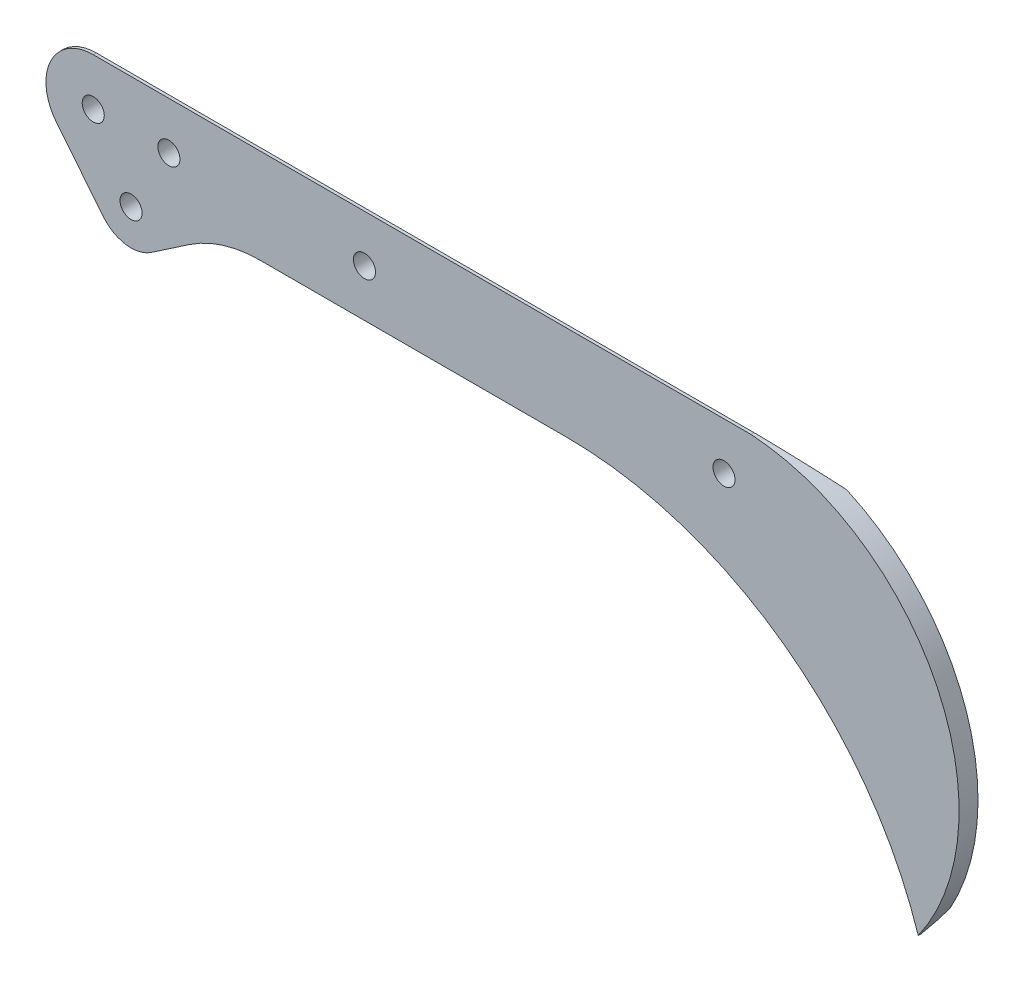
ISO-10303-21;
HEADER;
FILE_DESCRIPTION(('STEP AP214'),'2;1');
FILE_NAME('part.step','',(''),(''),'','','');
FILE_SCHEMA(('AUTOMOTIVE_DESIGN { 1 0 10303 214 1 1 1 1 }'));
ENDSEC;
DATA;
#1=APPLICATION_CONTEXT('core data for automotive mechanical design processes');
#2=APPLICATION_PROTOCOL_DEFINITION('international standard','automotive_design',2000,#1);
#3=PRODUCT_CONTEXT('',#1,'mechanical');
#4=PRODUCT('Part','Part','',(#3));
#5=PRODUCT_RELATED_PRODUCT_CATEGORY('part','',(#4));
#6=PRODUCT_DEFINITION_FORMATION('','',#4);
#7=PRODUCT_DEFINITION_CONTEXT('part definition',#1,'design');
#8=PRODUCT_DEFINITION('design','',#6,#7);
#9=PRODUCT_DEFINITION_SHAPE('','',#8);
#10=(LENGTH_UNIT() NAMED_UNIT(*) SI_UNIT(.MILLI.,.METRE.));
#11=(NAMED_UNIT(*) PLANE_ANGLE_UNIT() SI_UNIT($,.RADIAN.));
#12=(NAMED_UNIT(*) SI_UNIT($,.STERADIAN.) SOLID_ANGLE_UNIT());
#13=UNCERTAINTY_MEASURE_WITH_UNIT(LENGTH_MEASURE(1.E-05),#10,'distance_accuracy_value','');
#14=(GEOMETRIC_REPRESENTATION_CONTEXT(3) GLOBAL_UNCERTAINTY_ASSIGNED_CONTEXT((#13)) GLOBAL_UNIT_ASSIGNED_CONTEXT((#10,
#11,#12)) REPRESENTATION_CONTEXT('',''));
#15=CARTESIAN_POINT('',(0.,0.,0.));
#16=DIRECTION('',(0.,0.,1.));
#17=DIRECTION('',(1.,0.,0.));
#18=AXIS2_PLACEMENT_3D('',#15,#16,#17);
#19=CARTESIAN_POINT('',(-43.,0.,3.));
#20=DIRECTION('',(0.,0.,-1.));
#21=DIRECTION('',(-1.,0.,0.));
#22=AXIS2_PLACEMENT_3D('',#19,#20,#21);
#23=CYLINDRICAL_SURFACE('',#22,7.5);
#24=DIRECTION('',(0.,0.,-1.));
#25=VECTOR('',#24,1.);
#26=CARTESIAN_POINT('',(-43.,7.5,3.));
#27=LINE('',#26,#25);
#28=CARTESIAN_POINT('',(-43.,7.5,3.));
#29=VERTEX_POINT('',#28);
#30=CARTESIAN_POINT('',(-43.,7.5,2.51729889353185));
#31=VERTEX_POINT('',#30);
#32=EDGE_CURVE('E223',#29,#31,#27,.T.);
#33=ORIENTED_EDGE('',*,*,#32,.T.);
#34=CARTESIAN_POINT('',(-43.,0.,2.51729889353185));
#35=DIRECTION('',(0.,0.,1.));
#36=DIRECTION('',(1.,0.,0.));
#37=AXIS2_PLACEMENT_3D('',#34,#35,#36);
#38=CIRCLE('',#37,7.5);
#39=CARTESIAN_POINT('',(-48.8413704008258,-4.70408246530143,2.51729889353185));
#40=VERTEX_POINT('',#39);
#41=EDGE_CURVE('E386',#31,#40,#38,.T.);
#42=ORIENTED_EDGE('',*,*,#41,.T.);
#43=DIRECTION('',(0.,0.,-1.));
#44=VECTOR('',#43,1.);
#45=CARTESIAN_POINT('',(-48.8413704008258,-4.70408246530143,39.4567188799011));
#46=LINE('',#45,#44);
#47=CARTESIAN_POINT('',(-48.8413704008258,-4.70408246530143,3.));
#48=VERTEX_POINT('',#47);
#49=EDGE_CURVE('E166',#48,#40,#46,.T.);
#50=ORIENTED_EDGE('',*,*,#49,.F.);
#51=CARTESIAN_POINT('',(-43.,0.,3.));
#52=DIRECTION('',(0.,0.,1.));
#53=DIRECTION('',(1.,0.,0.));
#54=AXIS2_PLACEMENT_3D('',#51,#52,#53);
#55=CIRCLE('',#54,7.5);
#56=EDGE_CURVE('E172',#29,#48,#55,.T.);
#57=ORIENTED_EDGE('',*,*,#56,.F.);
#58=EDGE_LOOP('',(#33,#42,#50,#57));
#59=FACE_BOUND('',#58,.T.);
#60=ADVANCED_FACE('F43',(#59),#23,.T.);
#61=CARTESIAN_POINT('',(-43.,-7.5,3.));
#62=DIRECTION('',(0.,1.,0.));
#63=DIRECTION('',(-1.,0.,0.));
#64=AXIS2_PLACEMENT_3D('',#61,#62,#63);
#65=PLANE('',#64);
#66=DIRECTION('',(0.,0.,-1.));
#67=VECTOR('',#66,1.);
#68=CARTESIAN_POINT('',(-16.5222456176888,-7.5,0.));
#69=LINE('',#68,#67);
#70=CARTESIAN_POINT('',(-16.5222456176888,-7.5,3.));
#71=VERTEX_POINT('',#70);
#72=CARTESIAN_POINT('',(-16.5222456176888,-7.5,2.51729889353185));
#73=VERTEX_POINT('',#72);
#74=EDGE_CURVE('E226',#71,#73,#69,.T.);
#75=ORIENTED_EDGE('',*,*,#74,.T.);
#76=DIRECTION('',(1.,0.,0.));
#77=VECTOR('',#76,1.);
#78=CARTESIAN_POINT('',(-43.,-7.5,2.51729889353185));
#79=LINE('',#78,#77);
#80=CARTESIAN_POINT('',(32.,-7.5,2.51729889353185));
#81=VERTEX_POINT('',#80);
#82=EDGE_CURVE('E11',#73,#81,#79,.T.);
#83=ORIENTED_EDGE('',*,*,#82,.T.);
#84=DIRECTION('',(0.,0.,-1.));
#85=VECTOR('',#84,1.);
#86=CARTESIAN_POINT('',(32.,-7.5,3.));
#87=LINE('',#86,#85);
#88=CARTESIAN_POINT('',(32.,-7.5,3.));
#89=VERTEX_POINT('',#88);
#90=EDGE_CURVE('E197',#89,#81,#87,.T.);
#91=ORIENTED_EDGE('',*,*,#90,.F.);
#92=DIRECTION('',(1.,0.,0.));
#93=VECTOR('',#92,1.);
#94=CARTESIAN_POINT('',(-43.,-7.5,3.));
#95=LINE('',#94,#93);
#96=EDGE_CURVE('E219',#71,#89,#95,.T.);
#97=ORIENTED_EDGE('',*,*,#96,.F.);
#98=EDGE_LOOP('',(#75,#83,#91,#97));
#99=FACE_BOUND('',#98,.T.);
#100=ADVANCED_FACE('F284',(#99),#65,.F.);
#101=CARTESIAN_POINT('',(-43.,0.,3.));
#102=DIRECTION('',(0.,0.,1.));
#103=DIRECTION('',(1.,0.,0.));
#104=AXIS2_PLACEMENT_3D('',#101,#102,#103);
#105=PLANE('',#104);
#106=CARTESIAN_POINT('',(-31.,0.,3.));
#107=DIRECTION('',(0.,0.,1.));
#108=DIRECTION('',(1.,0.,0.));
#109=AXIS2_PLACEMENT_3D('',#106,#107,#108);
#110=CIRCLE('',#109,1.74999999999999);
#111=CARTESIAN_POINT('',(-29.25,0.,3.));
#112=VERTEX_POINT('',#111);
#113=EDGE_CURVE('E182',#112,#112,#110,.F.);
#114=ORIENTED_EDGE('',*,*,#113,.T.);
#115=EDGE_LOOP('',(#114));
#116=FACE_BOUND('',#115,.T.);
#117=DIRECTION('',(0.827442332059562,0.561550698615747,0.));
#118=VECTOR('',#117,1.);
#119=CARTESIAN_POINT('',(-3.66322793483711,5.39774925530179,3.));
#120=LINE('',#119,#118);
#121=CARTESIAN_POINT('',(-33.8244709758411,-15.0714320333055,3.));
#122=VERTEX_POINT('',#121);
#123=CARTESIAN_POINT('',(-27.7532595900038,-10.9511533588088,3.));
#124=VERTEX_POINT('',#123);
#125=EDGE_CURVE('E157',#122,#124,#120,.T.);
#126=ORIENTED_EDGE('',*,*,#125,.T.);
#127=CARTESIAN_POINT('',(-16.5222456176888,-27.5,3.));
#128=DIRECTION('',(0.,0.,1.));
#129=DIRECTION('',(1.,0.,0.));
#130=AXIS2_PLACEMENT_3D('',#127,#128,#129);
#131=CIRCLE('',#130,20.);
#132=EDGE_CURVE('E230',#124,#71,#131,.F.);
#133=ORIENTED_EDGE('',*,*,#132,.T.);
#134=ORIENTED_EDGE('',*,*,#96,.T.);
#135=CARTESIAN_POINT('',(32.,-66.1619570744237,3.));
#136=DIRECTION('',(0.,0.,-1.));
#137=DIRECTION('',(-1.,0.,0.));
#138=AXIS2_PLACEMENT_3D('',#135,#136,#137);
#139=CIRCLE('',#138,58.6619570744237);
#140=CARTESIAN_POINT('',(87.7947536589747,-48.0464755203536,3.));
#141=VERTEX_POINT('',#140);
#142=EDGE_CURVE('E186',#141,#89,#139,.F.);
#143=ORIENTED_EDGE('',*,*,#142,.F.);
#144=CARTESIAN_POINT('',(59.0168470576323,-27.6814449761465,3.));
#145=DIRECTION('',(0.,0.,-1.));
#146=DIRECTION('',(-1.,0.,0.));
#147=AXIS2_PLACEMENT_3D('',#144,#145,#146);
#148=CIRCLE('',#147,35.2548206267183);
#149=CARTESIAN_POINT('',(61.2902380958078,7.5,3.));
#150=VERTEX_POINT('',#149);
#151=EDGE_CURVE('E183',#141,#150,#148,.F.);
#152=ORIENTED_EDGE('',*,*,#151,.T.);
#153=DIRECTION('',(-1.,0.,0.));
#154=VECTOR('',#153,1.);
#155=CARTESIAN_POINT('',(-43.,7.5,3.));
#156=LINE('',#155,#154);
#157=EDGE_CURVE('E221',#150,#29,#156,.T.);
#158=ORIENTED_EDGE('',*,*,#157,.T.);
#159=ORIENTED_EDGE('',*,*,#56,.T.);
#160=DIRECTION('',(0.627210995373527,-0.77884938677677,0.));
#161=VECTOR('',#160,1.);
#162=CARTESIAN_POINT('',(-31.9254441939754,-25.7097071277331,3.));
#163=LINE('',#162,#161);
#164=CARTESIAN_POINT('',(-41.4043375589322,-13.9391381500283,3.));
#165=VERTEX_POINT('',#164);
#166=EDGE_CURVE('E158',#48,#165,#163,.T.);
#167=ORIENTED_EDGE('',*,*,#166,.T.);
#168=CARTESIAN_POINT('',(-37.,-10.3923048454132,3.));
#169=DIRECTION('',(0.,0.,1.));
#170=DIRECTION('',(1.,0.,0.));
#171=AXIS2_PLACEMENT_3D('',#168,#169,#170);
#172=CIRCLE('',#171,5.65492845434385);
#173=EDGE_CURVE('E147',#165,#122,#172,.T.);
#174=ORIENTED_EDGE('',*,*,#173,.T.);
#175=EDGE_LOOP('',(#126,#133,#134,#143,#152,#158,#159,#167,#174));
#176=FACE_BOUND('',#175,.T.);
#177=CARTESIAN_POINT('',(-43.,0.,3.));
#178=DIRECTION('',(0.,0.,1.));
#179=DIRECTION('',(1.,0.,0.));
#180=AXIS2_PLACEMENT_3D('',#177,#178,#179);
#181=CIRCLE('',#180,1.75);
#182=CARTESIAN_POINT('',(-41.25,0.,3.));
#183=VERTEX_POINT('',#182);
#184=EDGE_CURVE('E207',#183,#183,#181,.T.);
#185=ORIENTED_EDGE('',*,*,#184,.F.);
#186=EDGE_LOOP('',(#185));
#187=FACE_BOUND('',#186,.T.);
#188=CARTESIAN_POINT('',(-37.,-10.3923048454132,3.));
#189=DIRECTION('',(0.,0.,1.));
#190=DIRECTION('',(1.,0.,0.));
#191=AXIS2_PLACEMENT_3D('',#188,#189,#190);
#192=CIRCLE('',#191,1.75);
#193=CARTESIAN_POINT('',(-35.25,-10.3923048454132,3.));
#194=VERTEX_POINT('',#193);
#195=EDGE_CURVE('E176',#194,#194,#192,.T.);
#196=ORIENTED_EDGE('',*,*,#195,.F.);
#197=EDGE_LOOP('',(#196));
#198=FACE_BOUND('',#197,.T.);
#199=CARTESIAN_POINT('',(0.,0.,3.));
#200=DIRECTION('',(0.,0.,1.));
#201=DIRECTION('',(1.,0.,0.));
#202=AXIS2_PLACEMENT_3D('',#199,#200,#201);
#203=CIRCLE('',#202,1.75);
#204=CARTESIAN_POINT('',(1.75,0.,3.));
#205=VERTEX_POINT('',#204);
#206=EDGE_CURVE('E213',#205,#205,#203,.T.);
#207=ORIENTED_EDGE('',*,*,#206,.F.);
#208=EDGE_LOOP('',(#207));
#209=FACE_BOUND('',#208,.T.);
#210=CARTESIAN_POINT('',(57.,0.,3.));
#211=DIRECTION('',(0.,0.,1.));
#212=DIRECTION('',(1.,0.,0.));
#213=AXIS2_PLACEMENT_3D('',#210,#211,#212);
#214=CIRCLE('',#213,1.75000000000001);
#215=CARTESIAN_POINT('',(58.75,0.,3.));
#216=VERTEX_POINT('',#215);
#217=EDGE_CURVE('E201',#216,#216,#214,.T.);
#218=ORIENTED_EDGE('',*,*,#217,.F.);
#219=EDGE_LOOP('',(#218));
#220=FACE_BOUND('',#219,.T.);
#221=ADVANCED_FACE('F169',(#116,#176,#187,#198,#209,#220),#105,.T.);
#222=CARTESIAN_POINT('',(-43.,0.,0.));
#223=DIRECTION('',(0.,0.,1.));
#224=DIRECTION('',(1.,0.,0.));
#225=AXIS2_PLACEMENT_3D('',#222,#223,#224);
#226=PLANE('',#225);
#227=CARTESIAN_POINT('',(-31.,0.,0.));
#228=DIRECTION('',(0.,0.,1.));
#229=DIRECTION('',(1.,0.,0.));
#230=AXIS2_PLACEMENT_3D('',#227,#228,#229);
#231=CIRCLE('',#230,1.74999999999999);
#232=CARTESIAN_POINT('',(-29.25,0.,0.));
#233=VERTEX_POINT('',#232);
#234=EDGE_CURVE('E360',#233,#233,#231,.T.);
#235=ORIENTED_EDGE('',*,*,#234,.T.);
#236=EDGE_LOOP('',(#235));
#237=FACE_BOUND('',#236,.T.);
#238=CARTESIAN_POINT('',(-43.,0.,0.));
#239=DIRECTION('',(0.,0.,1.));
#240=DIRECTION('',(1.,0.,0.));
#241=AXIS2_PLACEMENT_3D('',#238,#239,#240);
#242=CIRCLE('',#241,4.49999999999998);
#243=CARTESIAN_POINT('',(-46.5048222404954,-2.82244947918084,0.));
#244=VERTEX_POINT('',#243);
#245=CARTESIAN_POINT('',(-43.,4.49999999999998,0.));
#246=VERTEX_POINT('',#245);
#247=EDGE_CURVE('E247',#244,#246,#242,.F.);
#248=ORIENTED_EDGE('',*,*,#247,.T.);
#249=DIRECTION('',(1.,0.,0.));
#250=VECTOR('',#249,1.);
#251=CARTESIAN_POINT('',(-43.,4.49999999999998,0.));
#252=LINE('',#251,#250);
#253=CARTESIAN_POINT('',(73.4132694142227,4.49999999999998,0.));
#254=VERTEX_POINT('',#253);
#255=EDGE_CURVE('E249',#246,#254,#252,.T.);
#256=ORIENTED_EDGE('',*,*,#255,.T.);
#257=CARTESIAN_POINT('',(59.0168470576323,-27.6814449761465,0.));
#258=DIRECTION('',(0.,0.,-1.));
#259=DIRECTION('',(-1.,0.,0.));
#260=AXIS2_PLACEMENT_3D('',#257,#258,#259);
#261=CIRCLE('',#260,35.2548206267183);
#262=CARTESIAN_POINT('',(89.8407103919388,-44.7926058534825,0.));
#263=VERTEX_POINT('',#262);
#264=EDGE_CURVE('E187',#263,#254,#261,.F.);
#265=ORIENTED_EDGE('',*,*,#264,.F.);
#266=CARTESIAN_POINT('',(32.,-66.1619570744237,0.));
#267=DIRECTION('',(0.,0.,1.));
#268=DIRECTION('',(1.,0.,0.));
#269=AXIS2_PLACEMENT_3D('',#266,#267,#268);
#270=CIRCLE('',#269,61.6619570744237);
#271=CARTESIAN_POINT('',(32.,-4.49999999999998,0.));
#272=VERTEX_POINT('',#271);
#273=EDGE_CURVE('E237',#263,#272,#270,.T.);
#274=ORIENTED_EDGE('',*,*,#273,.T.);
#275=DIRECTION('',(-1.,0.,0.));
#276=VECTOR('',#275,1.);
#277=CARTESIAN_POINT('',(-43.,-4.49999999999998,0.));
#278=LINE('',#277,#276);
#279=CARTESIAN_POINT('',(-16.5222456176888,-4.49999999999998,0.));
#280=VERTEX_POINT('',#279);
#281=EDGE_CURVE('E235',#272,#280,#278,.T.);
#282=ORIENTED_EDGE('',*,*,#281,.T.);
#283=CARTESIAN_POINT('',(-16.5222456176888,-27.5,0.));
#284=DIRECTION('',(0.,0.,1.));
#285=DIRECTION('',(1.,0.,0.));
#286=AXIS2_PLACEMENT_3D('',#283,#284,#285);
#287=CIRCLE('',#286,23.);
#288=CARTESIAN_POINT('',(-29.437911685851,-8.46882636263007,0.));
#289=VERTEX_POINT('',#288);
#290=EDGE_CURVE('E239',#280,#289,#287,.T.);
#291=ORIENTED_EDGE('',*,*,#290,.T.);
#292=DIRECTION('',(-0.827442332059562,-0.561550698615747,0.));
#293=VECTOR('',#292,1.);
#294=CARTESIAN_POINT('',(-34.7882949847035,-12.099908992708,0.));
#295=LINE('',#294,#293);
#296=CARTESIAN_POINT('',(-35.5091230716884,-12.5891050371268,0.));
#297=VERTEX_POINT('',#296);
#298=EDGE_CURVE('E241',#289,#297,#295,.T.);
#299=ORIENTED_EDGE('',*,*,#298,.T.);
#300=CARTESIAN_POINT('',(-37.,-10.3923048454132,0.));
#301=DIRECTION('',(0.,0.,1.));
#302=DIRECTION('',(1.,0.,0.));
#303=AXIS2_PLACEMENT_3D('',#300,#301,#302);
#304=CIRCLE('',#303,2.65492845434383);
#305=CARTESIAN_POINT('',(-39.0677893986019,-12.0575051639077,0.));
#306=VERTEX_POINT('',#305);
#307=EDGE_CURVE('E243',#297,#306,#304,.F.);
#308=ORIENTED_EDGE('',*,*,#307,.T.);
#309=DIRECTION('',(-0.627210995373527,0.77884938677677,0.));
#310=VECTOR('',#309,1.);
#311=CARTESIAN_POINT('',(-46.5048222404954,-2.82244947918085,0.));
#312=LINE('',#311,#310);
#313=EDGE_CURVE('E245',#306,#244,#312,.T.);
#314=ORIENTED_EDGE('',*,*,#313,.T.);
#315=EDGE_LOOP('',(#248,#256,#265,#274,#282,#291,#299,#308,#314));
#316=FACE_BOUND('',#315,.T.);
#317=CARTESIAN_POINT('',(-43.,0.,0.));
#318=DIRECTION('',(0.,0.,1.));
#319=DIRECTION('',(1.,0.,0.));
#320=AXIS2_PLACEMENT_3D('',#317,#318,#319);
#321=CIRCLE('',#320,1.75);
#322=CARTESIAN_POINT('',(-41.25,0.,0.));
#323=VERTEX_POINT('',#322);
#324=EDGE_CURVE('E204',#323,#323,#321,.T.);
#325=ORIENTED_EDGE('',*,*,#324,.T.);
#326=EDGE_LOOP('',(#325));
#327=FACE_BOUND('',#326,.T.);
#328=CARTESIAN_POINT('',(-37.,-10.3923048454132,0.));
#329=DIRECTION('',(0.,0.,1.));
#330=DIRECTION('',(1.,0.,0.));
#331=AXIS2_PLACEMENT_3D('',#328,#329,#330);
#332=CIRCLE('',#331,1.75);
#333=CARTESIAN_POINT('',(-35.25,-10.3923048454132,0.));
#334=VERTEX_POINT('',#333);
#335=EDGE_CURVE('E173',#334,#334,#332,.T.);
#336=ORIENTED_EDGE('',*,*,#335,.T.);
#337=EDGE_LOOP('',(#336));
#338=FACE_BOUND('',#337,.T.);
#339=CARTESIAN_POINT('',(57.,0.,0.));
#340=DIRECTION('',(0.,0.,1.));
#341=DIRECTION('',(1.,0.,0.));
#342=AXIS2_PLACEMENT_3D('',#339,#340,#341);
#343=CIRCLE('',#342,1.75000000000001);
#344=CARTESIAN_POINT('',(58.75,0.,0.));
#345=VERTEX_POINT('',#344);
#346=EDGE_CURVE('E196',#345,#345,#343,.T.);
#347=ORIENTED_EDGE('',*,*,#346,.T.);
#348=EDGE_LOOP('',(#347));
#349=FACE_BOUND('',#348,.T.);
#350=CARTESIAN_POINT('',(0.,0.,0.));
#351=DIRECTION('',(0.,0.,1.));
#352=DIRECTION('',(1.,0.,0.));
#353=AXIS2_PLACEMENT_3D('',#350,#351,#352);
#354=CIRCLE('',#353,1.75);
#355=CARTESIAN_POINT('',(1.75,0.,0.));
#356=VERTEX_POINT('',#355);
#357=EDGE_CURVE('E210',#356,#356,#354,.T.);
#358=ORIENTED_EDGE('',*,*,#357,.T.);
#359=EDGE_LOOP('',(#358));
#360=FACE_BOUND('',#359,.T.);
#361=ADVANCED_FACE('F283',(#237,#316,#327,#338,#349,#360),#226,.F.);
#362=CARTESIAN_POINT('',(-43.,7.5,3.));
#363=DIRECTION('',(0.,-1.,0.));
#364=DIRECTION('',(1.,0.,0.));
#365=AXIS2_PLACEMENT_3D('',#362,#363,#364);
#366=PLANE('',#365);
#367=DIRECTION('',(0.,0.,-1.));
#368=VECTOR('',#367,1.);
#369=CARTESIAN_POINT('',(61.2902380958078,7.5,3.));
#370=LINE('',#369,#368);
#371=CARTESIAN_POINT('',(61.2902380958078,7.5,2.51729889353185));
#372=VERTEX_POINT('',#371);
#373=EDGE_CURVE('E193',#150,#372,#370,.T.);
#374=ORIENTED_EDGE('',*,*,#373,.T.);
#375=DIRECTION('',(-1.,0.,0.));
#376=VECTOR('',#375,1.);
#377=CARTESIAN_POINT('',(-43.,7.5,2.51729889353185));
#378=LINE('',#377,#376);
#379=EDGE_CURVE('E232',#372,#31,#378,.T.);
#380=ORIENTED_EDGE('',*,*,#379,.T.);
#381=ORIENTED_EDGE('',*,*,#32,.F.);
#382=ORIENTED_EDGE('',*,*,#157,.F.);
#383=EDGE_LOOP('',(#374,#380,#381,#382));
#384=FACE_BOUND('',#383,.T.);
#385=ADVANCED_FACE('F279',(#384),#366,.F.);
#386=CARTESIAN_POINT('',(0.,0.,3.));
#387=DIRECTION('',(0.,0.,-1.));
#388=DIRECTION('',(-1.,0.,0.));
#389=AXIS2_PLACEMENT_3D('',#386,#387,#388);
#390=CYLINDRICAL_SURFACE('',#389,1.75);
#391=ORIENTED_EDGE('',*,*,#206,.T.);
#392=EDGE_LOOP('',(#391));
#393=FACE_BOUND('',#392,.T.);
#394=ORIENTED_EDGE('',*,*,#357,.F.);
#395=EDGE_LOOP('',(#394));
#396=FACE_BOUND('',#395,.T.);
#397=ADVANCED_FACE('F275',(#393,#396),#390,.F.);
#398=CARTESIAN_POINT('',(-43.,0.,3.));
#399=DIRECTION('',(0.,0.,-1.));
#400=DIRECTION('',(-1.,0.,0.));
#401=AXIS2_PLACEMENT_3D('',#398,#399,#400);
#402=CYLINDRICAL_SURFACE('',#401,1.75);
#403=ORIENTED_EDGE('',*,*,#184,.T.);
#404=EDGE_LOOP('',(#403));
#405=FACE_BOUND('',#404,.T.);
#406=ORIENTED_EDGE('',*,*,#324,.F.);
#407=EDGE_LOOP('',(#406));
#408=FACE_BOUND('',#407,.T.);
#409=ADVANCED_FACE('F271',(#405,#408),#402,.F.);
#410=CARTESIAN_POINT('',(57.,0.,3.));
#411=DIRECTION('',(0.,0.,-1.));
#412=DIRECTION('',(-1.,0.,0.));
#413=AXIS2_PLACEMENT_3D('',#410,#411,#412);
#414=CYLINDRICAL_SURFACE('',#413,1.75000000000001);
#415=ORIENTED_EDGE('',*,*,#217,.T.);
#416=EDGE_LOOP('',(#415));
#417=FACE_BOUND('',#416,.T.);
#418=ORIENTED_EDGE('',*,*,#346,.F.);
#419=EDGE_LOOP('',(#418));
#420=FACE_BOUND('',#419,.T.);
#421=ADVANCED_FACE('F266',(#417,#420),#414,.F.);
#422=CARTESIAN_POINT('',(59.0168470576323,-27.6814449761465,3.));
#423=DIRECTION('',(0.,0.,-1.));
#424=DIRECTION('',(-1.,0.,0.));
#425=AXIS2_PLACEMENT_3D('',#422,#423,#424);
#426=CYLINDRICAL_SURFACE('',#425,35.2548206267183);
#427=ORIENTED_EDGE('',*,*,#264,.T.);
#428=CARTESIAN_POINT('',(59.0168470576323,-27.6814449761465,-27.0034386102364));
#429=DIRECTION('',(0.,-0.642787609686538,0.766044443118979));
#430=DIRECTION('',(0.,-0.766044443118979,-0.642787609686538));
#431=AXIS2_PLACEMENT_3D('',#428,#429,#430);
#432=ELLIPSE('',#431,46.0218998302199,35.2548206267183);
#433=EDGE_CURVE('E258',#254,#372,#432,.T.);
#434=ORIENTED_EDGE('',*,*,#433,.T.);
#435=ORIENTED_EDGE('',*,*,#373,.F.);
#436=ORIENTED_EDGE('',*,*,#151,.F.);
#437=DIRECTION('',(0.,0.,-1.));
#438=VECTOR('',#437,1.);
#439=CARTESIAN_POINT('',(87.7947536589747,-48.0464755203536,3.));
#440=LINE('',#439,#438);
#441=CARTESIAN_POINT('',(87.7947536589747,-48.0464755203536,2.51729889353185));
#442=VERTEX_POINT('',#441);
#443=EDGE_CURVE('E190',#141,#442,#440,.T.);
#444=ORIENTED_EDGE('',*,*,#443,.T.);
#445=CARTESIAN_POINT('',(87.7947536589747,-48.0464755203536,2.51729889353185));
#446=CARTESIAN_POINT('',(87.9784021522671,-47.7869620313146,2.30348515243477));
#447=CARTESIAN_POINT('',(88.1589103865616,-47.524439468202,2.09062272265301));
#448=CARTESIAN_POINT('',(88.5133418449481,-46.9936418613411,1.66698507076413));
#449=CARTESIAN_POINT('',(88.6872687027991,-46.7253701239244,1.45620874577479));
#450=CARTESIAN_POINT('',(89.0284398840761,-46.1830476352718,1.03668726733998));
#451=CARTESIAN_POINT('',(89.1956841814427,-45.9089968615062,0.827942121817771));
#452=CARTESIAN_POINT('',(89.5233755290286,-45.3550896212279,0.412435432511892));
#453=CARTESIAN_POINT('',(89.6838187151089,-45.0752299853503,0.205675066669016));
#454=CARTESIAN_POINT('',(89.8407103919388,-44.7926058534825,0.));
#455=B_SPLINE_CURVE_WITH_KNOTS('',3,(#445,#446,#447,#448,#449,#450,#451,#452,#453,#454),
.UNSPECIFIED.,.F.,.F.,(4,2,2,2,4),(0.,1.14937392329191,2.29810370005948,3.44683795601455,
4.59621636376182),.UNSPECIFIED.);
#456=EDGE_CURVE('E251',#442,#263,#455,.T.);
#457=ORIENTED_EDGE('',*,*,#456,.T.);
#458=EDGE_LOOP('',(#427,#434,#435,#436,#444,#457));
#459=FACE_BOUND('',#458,.T.);
#460=ADVANCED_FACE('F260',(#459),#426,.T.);
#461=CARTESIAN_POINT('',(32.,-66.1619570744237,3.));
#462=DIRECTION('',(0.,0.,-1.));
#463=DIRECTION('',(-1.,0.,0.));
#464=AXIS2_PLACEMENT_3D('',#461,#462,#463);
#465=CYLINDRICAL_SURFACE('',#464,58.6619570744237);
#466=ORIENTED_EDGE('',*,*,#90,.T.);
#467=CARTESIAN_POINT('',(32.,-66.1619570744237,2.51729889353185));
#468=DIRECTION('',(0.,0.,1.));
#469=DIRECTION('',(1.,0.,0.));
#470=AXIS2_PLACEMENT_3D('',#467,#468,#469);
#471=CIRCLE('',#470,58.6619570744237);
#472=EDGE_CURVE('E54',#81,#442,#471,.F.);
#473=ORIENTED_EDGE('',*,*,#472,.T.);
#474=ORIENTED_EDGE('',*,*,#443,.F.);
#475=ORIENTED_EDGE('',*,*,#142,.T.);
#476=EDGE_LOOP('',(#466,#473,#474,#475));
#477=FACE_BOUND('',#476,.T.);
#478=ADVANCED_FACE('F265',(#477),#465,.F.);
#479=CARTESIAN_POINT('',(-31.9254441939754,-25.7097071277331,39.4567188799011));
#480=DIRECTION('',(0.77884938677677,0.627210995373527,0.));
#481=DIRECTION('',(-0.627210995373527,0.77884938677677,0.));
#482=AXIS2_PLACEMENT_3D('',#479,#480,#481);
#483=PLANE('',#482);
#484=ORIENTED_EDGE('',*,*,#49,.T.);
#485=DIRECTION('',(0.627210995373527,-0.77884938677677,0.));
#486=VECTOR('',#485,1.);
#487=CARTESIAN_POINT('',(-31.9254441939754,-25.7097071277331,2.51729889353185));
#488=LINE('',#487,#486);
#489=CARTESIAN_POINT('',(-41.4043375589322,-13.9391381500283,2.51729889353185));
#490=VERTEX_POINT('',#489);
#491=EDGE_CURVE('E165',#40,#490,#488,.T.);
#492=ORIENTED_EDGE('',*,*,#491,.T.);
#493=DIRECTION('',(0.,0.,-1.));
#494=VECTOR('',#493,1.);
#495=CARTESIAN_POINT('',(-41.4043375589322,-13.9391381500283,39.4567188799011));
#496=LINE('',#495,#494);
#497=EDGE_CURVE('E150',#165,#490,#496,.T.);
#498=ORIENTED_EDGE('',*,*,#497,.F.);
#499=ORIENTED_EDGE('',*,*,#166,.F.);
#500=EDGE_LOOP('',(#484,#492,#498,#499));
#501=FACE_BOUND('',#500,.T.);
#502=ADVANCED_FACE('F162',(#501),#483,.F.);
#503=CARTESIAN_POINT('',(-37.,-10.3923048454132,39.4567188799011));
#504=DIRECTION('',(0.,0.,-1.));
#505=DIRECTION('',(-1.,0.,0.));
#506=AXIS2_PLACEMENT_3D('',#503,#504,#505);
#507=CYLINDRICAL_SURFACE('',#506,5.65492845434385);
#508=ORIENTED_EDGE('',*,*,#497,.T.);
#509=CARTESIAN_POINT('',(-37.,-10.3923048454132,2.51729889353185));
#510=DIRECTION('',(0.,0.,1.));
#511=DIRECTION('',(1.,0.,0.));
#512=AXIS2_PLACEMENT_3D('',#509,#510,#511);
#513=CIRCLE('',#512,5.65492845434385);
#514=CARTESIAN_POINT('',(-33.8244709758411,-15.0714320333055,2.51729889353185));
#515=VERTEX_POINT('',#514);
#516=EDGE_CURVE('E384',#490,#515,#513,.T.);
#517=ORIENTED_EDGE('',*,*,#516,.T.);
#518=DIRECTION('',(0.,0.,-1.));
#519=VECTOR('',#518,1.);
#520=CARTESIAN_POINT('',(-33.8244709758411,-15.0714320333055,39.4567188799011));
#521=LINE('',#520,#519);
#522=EDGE_CURVE('E153',#122,#515,#521,.T.);
#523=ORIENTED_EDGE('',*,*,#522,.F.);
#524=ORIENTED_EDGE('',*,*,#173,.F.);
#525=EDGE_LOOP('',(#508,#517,#523,#524));
#526=FACE_BOUND('',#525,.T.);
#527=ADVANCED_FACE('F149',(#526),#507,.T.);
#528=CARTESIAN_POINT('',(-3.66322793483711,5.39774925530179,39.4567188799011));
#529=DIRECTION('',(-0.561550698615747,0.827442332059562,0.));
#530=DIRECTION('',(-0.827442332059562,-0.561550698615747,0.));
#531=AXIS2_PLACEMENT_3D('',#528,#529,#530);
#532=PLANE('',#531);
#533=ORIENTED_EDGE('',*,*,#522,.T.);
#534=DIRECTION('',(0.827442332059562,0.561550698615747,0.));
#535=VECTOR('',#534,1.);
#536=CARTESIAN_POINT('',(-3.66322793483711,5.39774925530179,2.51729889353185));
#537=LINE('',#536,#535);
#538=CARTESIAN_POINT('',(-27.7532595900038,-10.9511533588088,2.51729889353185));
#539=VERTEX_POINT('',#538);
#540=EDGE_CURVE('E382',#515,#539,#537,.T.);
#541=ORIENTED_EDGE('',*,*,#540,.T.);
#542=DIRECTION('',(0.,0.,-1.));
#543=VECTOR('',#542,1.);
#544=CARTESIAN_POINT('',(-27.7532595900038,-10.9511533588088,3.));
#545=LINE('',#544,#543);
#546=EDGE_CURVE('E228',#539,#124,#545,.F.);
#547=ORIENTED_EDGE('',*,*,#546,.T.);
#548=ORIENTED_EDGE('',*,*,#125,.F.);
#549=EDGE_LOOP('',(#533,#541,#547,#548));
#550=FACE_BOUND('',#549,.T.);
#551=ADVANCED_FACE('F404',(#550),#532,.F.);
#552=CARTESIAN_POINT('',(-37.,-10.3923048454132,39.4567188799011));
#553=DIRECTION('',(0.,0.,-1.));
#554=DIRECTION('',(-1.,0.,0.));
#555=AXIS2_PLACEMENT_3D('',#552,#553,#554);
#556=CYLINDRICAL_SURFACE('',#555,1.75);
#557=ORIENTED_EDGE('',*,*,#335,.F.);
#558=EDGE_LOOP('',(#557));
#559=FACE_BOUND('',#558,.T.);
#560=ORIENTED_EDGE('',*,*,#195,.T.);
#561=EDGE_LOOP('',(#560));
#562=FACE_BOUND('',#561,.T.);
#563=ADVANCED_FACE('F301',(#559,#562),#556,.F.);
#564=CARTESIAN_POINT('',(-16.5222456176888,-27.5,3.));
#565=DIRECTION('',(0.,0.,1.));
#566=DIRECTION('',(1.,0.,0.));
#567=AXIS2_PLACEMENT_3D('',#564,#565,#566);
#568=CYLINDRICAL_SURFACE('',#567,20.);
#569=ORIENTED_EDGE('',*,*,#546,.F.);
#570=CARTESIAN_POINT('',(-16.5222456176888,-27.5,2.51729889353185));
#571=DIRECTION('',(0.,0.,1.));
#572=DIRECTION('',(1.,0.,0.));
#573=AXIS2_PLACEMENT_3D('',#570,#571,#572);
#574=CIRCLE('',#573,20.);
#575=EDGE_CURVE('E68',#539,#73,#574,.F.);
#576=ORIENTED_EDGE('',*,*,#575,.T.);
#577=ORIENTED_EDGE('',*,*,#74,.F.);
#578=ORIENTED_EDGE('',*,*,#132,.F.);
#579=EDGE_LOOP('',(#569,#576,#577,#578));
#580=FACE_BOUND('',#579,.T.);
#581=ADVANCED_FACE('F297',(#580),#568,.F.);
#582=CARTESIAN_POINT('',(-31.,0.,10.));
#583=DIRECTION('',(0.,0.,-1.));
#584=DIRECTION('',(-1.,0.,0.));
#585=AXIS2_PLACEMENT_3D('',#582,#583,#584);
#586=CYLINDRICAL_SURFACE('',#585,1.74999999999999);
#587=ORIENTED_EDGE('',*,*,#113,.F.);
#588=EDGE_LOOP('',(#587));
#589=FACE_BOUND('',#588,.T.);
#590=ORIENTED_EDGE('',*,*,#234,.F.);
#591=EDGE_LOOP('',(#590));
#592=FACE_BOUND('',#591,.T.);
#593=ADVANCED_FACE('F300',(#589,#592),#586,.F.);
#594=CARTESIAN_POINT('',(32.,-66.1619570744237,0.));
#595=DIRECTION('',(0.,0.,-1.));
#596=DIRECTION('',(-1.,0.,0.));
#597=AXIS2_PLACEMENT_3D('',#594,#595,#596);
#598=CONICAL_SURFACE('',#597,61.6619570744237,0.872664625997166);
#599=ORIENTED_EDGE('',*,*,#456,.F.);
#600=ORIENTED_EDGE('',*,*,#472,.F.);
#601=DIRECTION('',(0.,-0.766044443118979,0.642787609686538));
#602=VECTOR('',#601,1.);
#603=CARTESIAN_POINT('',(32.,-4.49999999999998,0.));
#604=LINE('',#603,#602);
#605=EDGE_CURVE('E49',#272,#81,#604,.T.);
#606=ORIENTED_EDGE('',*,*,#605,.F.);
#607=ORIENTED_EDGE('',*,*,#273,.F.);
#608=EDGE_LOOP('',(#599,#600,#606,#607));
#609=FACE_BOUND('',#608,.T.);
#610=ADVANCED_FACE('F46',(#609),#598,.F.);
#611=CARTESIAN_POINT('',(-43.,-7.5,2.51729889353185));
#612=DIRECTION('',(0.,0.642787609686538,0.766044443118979));
#613=DIRECTION('',(1.,0.,0.));
#614=AXIS2_PLACEMENT_3D('',#611,#612,#613);
#615=PLANE('',#614);
#616=ORIENTED_EDGE('',*,*,#605,.T.);
#617=ORIENTED_EDGE('',*,*,#82,.F.);
#618=DIRECTION('',(0.,-0.766044443118979,0.642787609686538));
#619=VECTOR('',#618,1.);
#620=CARTESIAN_POINT('',(-16.5222456176888,-4.49999999999998,0.));
#621=LINE('',#620,#619);
#622=EDGE_CURVE('E361',#280,#73,#621,.T.);
#623=ORIENTED_EDGE('',*,*,#622,.F.);
#624=ORIENTED_EDGE('',*,*,#281,.F.);
#625=EDGE_LOOP('',(#616,#617,#623,#624));
#626=FACE_BOUND('',#625,.T.);
#627=ADVANCED_FACE('F343',(#626),#615,.F.);
#628=CARTESIAN_POINT('',(-16.5222456176888,-27.5,0.));
#629=DIRECTION('',(0.,0.,-1.));
#630=DIRECTION('',(-1.,0.,0.));
#631=AXIS2_PLACEMENT_3D('',#628,#629,#630);
#632=CONICAL_SURFACE('',#631,23.,0.872664625997166);
#633=ORIENTED_EDGE('',*,*,#622,.T.);
#634=ORIENTED_EDGE('',*,*,#575,.F.);
#635=DIRECTION('',(0.430172792204174,-0.633857600475636,0.642787609686538));
#636=VECTOR('',#635,1.);
#637=CARTESIAN_POINT('',(-29.437911685851,-8.46882636263007,0.));
#638=LINE('',#637,#636);
#639=EDGE_CURVE('E364',#289,#539,#638,.T.);
#640=ORIENTED_EDGE('',*,*,#639,.F.);
#641=ORIENTED_EDGE('',*,*,#290,.F.);
#642=EDGE_LOOP('',(#633,#634,#640,#641));
#643=FACE_BOUND('',#642,.T.);
#644=ADVANCED_FACE('F337',(#643),#632,.F.);
#645=CARTESIAN_POINT('',(-3.66322793483711,5.39774925530179,2.51729889353185));
#646=DIRECTION('',(-0.360957831281022,0.53186967877802,0.766044443118979));
#647=DIRECTION('',(0.827442332059562,0.561550698615747,0.));
#648=AXIS2_PLACEMENT_3D('',#645,#646,#647);
#649=PLANE('',#648);
#650=ORIENTED_EDGE('',*,*,#639,.T.);
#651=ORIENTED_EDGE('',*,*,#540,.F.);
#652=DIRECTION('',(0.430172792204173,-0.633857600475637,0.642787609686538));
#653=VECTOR('',#652,1.);
#654=CARTESIAN_POINT('',(-35.5091230716884,-12.5891050371268,0.));
#655=LINE('',#654,#653);
#656=EDGE_CURVE('E367',#297,#515,#655,.T.);
#657=ORIENTED_EDGE('',*,*,#656,.F.);
#658=ORIENTED_EDGE('',*,*,#298,.F.);
#659=EDGE_LOOP('',(#650,#651,#657,#658));
#660=FACE_BOUND('',#659,.T.);
#661=ADVANCED_FACE('F330',(#660),#649,.F.);
#662=CARTESIAN_POINT('',(-37.,-10.3923048454132,2.51729889353185));
#663=DIRECTION('',(0.,0.,1.));
#664=DIRECTION('',(1.,0.,0.));
#665=AXIS2_PLACEMENT_3D('',#662,#663,#664);
#666=CONICAL_SURFACE('',#665,5.65492845434385,0.872664625997166);
#667=ORIENTED_EDGE('',*,*,#656,.T.);
#668=ORIENTED_EDGE('',*,*,#516,.F.);
#669=DIRECTION('',(-0.59663324476697,-0.480471497669013,0.642787609686538));
#670=VECTOR('',#669,1.);
#671=CARTESIAN_POINT('',(-39.0677893986019,-12.0575051639077,0.));
#672=LINE('',#671,#670);
#673=EDGE_CURVE('E372',#306,#490,#672,.T.);
#674=ORIENTED_EDGE('',*,*,#673,.F.);
#675=ORIENTED_EDGE('',*,*,#307,.F.);
#676=EDGE_LOOP('',(#667,#668,#674,#675));
#677=FACE_BOUND('',#676,.T.);
#678=ADVANCED_FACE('F323',(#677),#666,.T.);
#679=CARTESIAN_POINT('',(-31.9254441939754,-25.7097071277331,2.51729889353185));
#680=DIRECTION('',(0.500634735632066,0.403163456485263,0.766044443118979));
#681=DIRECTION('',(0.627210995373527,-0.77884938677677,0.));
#682=AXIS2_PLACEMENT_3D('',#679,#680,#681);
#683=PLANE('',#682);
#684=ORIENTED_EDGE('',*,*,#673,.T.);
#685=ORIENTED_EDGE('',*,*,#491,.F.);
#686=DIRECTION('',(-0.59663324476697,-0.480471497669013,0.642787609686538));
#687=VECTOR('',#686,1.);
#688=CARTESIAN_POINT('',(-46.5048222404954,-2.82244947918084,0.));
#689=LINE('',#688,#687);
#690=EDGE_CURVE('E375',#244,#40,#689,.T.);
#691=ORIENTED_EDGE('',*,*,#690,.F.);
#692=ORIENTED_EDGE('',*,*,#313,.F.);
#693=EDGE_LOOP('',(#684,#685,#691,#692));
#694=FACE_BOUND('',#693,.T.);
#695=ADVANCED_FACE('F316',(#694),#683,.F.);
#696=CARTESIAN_POINT('',(-43.,0.,2.51729889353185));
#697=DIRECTION('',(0.,0.,1.));
#698=DIRECTION('',(1.,0.,0.));
#699=AXIS2_PLACEMENT_3D('',#696,#697,#698);
#700=CONICAL_SURFACE('',#699,7.5,0.872664625997166);
#701=ORIENTED_EDGE('',*,*,#690,.T.);
#702=ORIENTED_EDGE('',*,*,#41,.F.);
#703=DIRECTION('',(0.,0.766044443118979,0.642787609686538));
#704=VECTOR('',#703,1.);
#705=CARTESIAN_POINT('',(-43.,4.49999999999998,0.));
#706=LINE('',#705,#704);
#707=EDGE_CURVE('E378',#246,#31,#706,.T.);
#708=ORIENTED_EDGE('',*,*,#707,.F.);
#709=ORIENTED_EDGE('',*,*,#247,.F.);
#710=EDGE_LOOP('',(#701,#702,#708,#709));
#711=FACE_BOUND('',#710,.T.);
#712=ADVANCED_FACE('F309',(#711),#700,.T.);
#713=CARTESIAN_POINT('',(-43.,7.5,2.51729889353185));
#714=DIRECTION('',(0.,-0.642787609686538,0.766044443118979));
#715=DIRECTION('',(-1.,0.,0.));
#716=AXIS2_PLACEMENT_3D('',#713,#714,#715);
#717=PLANE('',#716);
#718=ORIENTED_EDGE('',*,*,#433,.F.);
#719=ORIENTED_EDGE('',*,*,#255,.F.);
#720=ORIENTED_EDGE('',*,*,#707,.T.);
#721=ORIENTED_EDGE('',*,*,#379,.F.);
#722=EDGE_LOOP('',(#718,#719,#720,#721));
#723=FACE_BOUND('',#722,.T.);
#724=ADVANCED_FACE('F303',(#723),#717,.F.);
#725=CLOSED_SHELL('',(#60,#100,#221,#361,#385,#397,#409,#421,#460,#478,#502,#527,#551,#563,#581,
#593,#610,#627,#644,#661,#678,#695,#712,#724));
#726=MANIFOLD_SOLID_BREP('B2',#725);
#727=ADVANCED_BREP_SHAPE_REPRESENTATION('',(#18,#726),#14);
#728=SHAPE_DEFINITION_REPRESENTATION(#9,#727);
ENDSEC;
END-ISO-10303-21;
